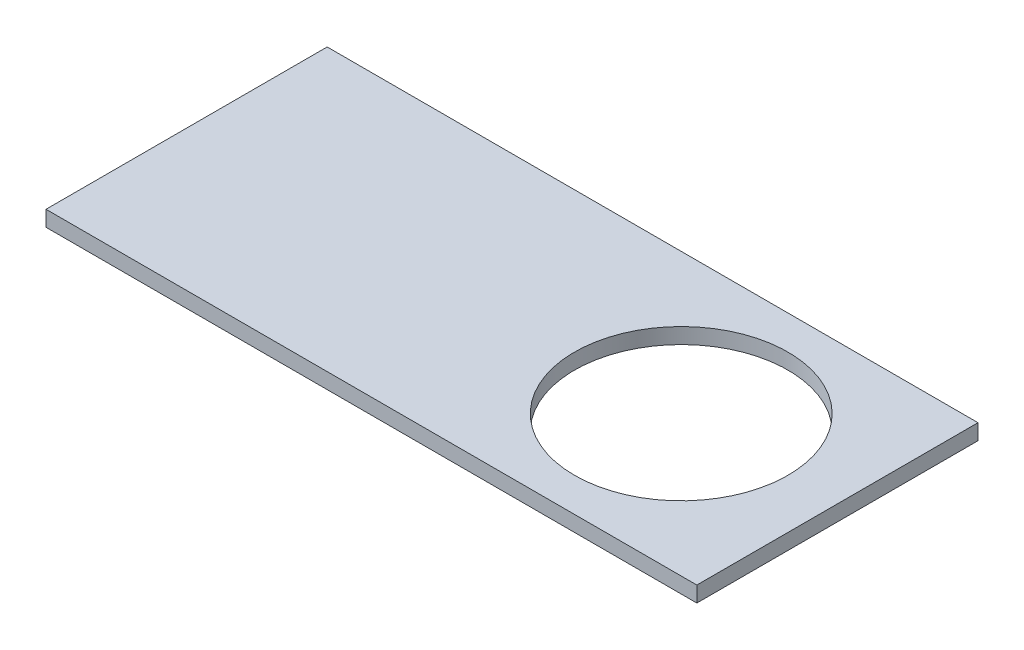
ISO-10303-21;
HEADER;
FILE_DESCRIPTION(('STEP AP214'),'2;1');
FILE_NAME('part.step','',(''),(''),'','','');
FILE_SCHEMA(('AUTOMOTIVE_DESIGN { 1 0 10303 214 1 1 1 1 }'));
ENDSEC;
DATA;
#1=APPLICATION_CONTEXT('core data for automotive mechanical design processes');
#2=APPLICATION_PROTOCOL_DEFINITION('international standard','automotive_design',2000,#1);
#3=PRODUCT_CONTEXT('',#1,'mechanical');
#4=PRODUCT('Part','Part','',(#3));
#5=PRODUCT_RELATED_PRODUCT_CATEGORY('part','',(#4));
#6=PRODUCT_DEFINITION_FORMATION('','',#4);
#7=PRODUCT_DEFINITION_CONTEXT('part definition',#1,'design');
#8=PRODUCT_DEFINITION('design','',#6,#7);
#9=PRODUCT_DEFINITION_SHAPE('','',#8);
#10=(LENGTH_UNIT() NAMED_UNIT(*) SI_UNIT(.MILLI.,.METRE.));
#11=(NAMED_UNIT(*) PLANE_ANGLE_UNIT() SI_UNIT($,.RADIAN.));
#12=(NAMED_UNIT(*) SI_UNIT($,.STERADIAN.) SOLID_ANGLE_UNIT());
#13=UNCERTAINTY_MEASURE_WITH_UNIT(LENGTH_MEASURE(1.E-05),#10,'distance_accuracy_value','');
#14=(GEOMETRIC_REPRESENTATION_CONTEXT(3) GLOBAL_UNCERTAINTY_ASSIGNED_CONTEXT((#13)) GLOBAL_UNIT_ASSIGNED_CONTEXT((#10,
#11,#12)) REPRESENTATION_CONTEXT('',''));
#15=CARTESIAN_POINT('',(0.,0.,0.));
#16=DIRECTION('',(0.,0.,1.));
#17=DIRECTION('',(1.,0.,0.));
#18=AXIS2_PLACEMENT_3D('',#15,#16,#17);
#19=CARTESIAN_POINT('',(0.,6.,0.));
#20=DIRECTION('',(0.,-1.,0.));
#21=DIRECTION('',(0.,0.,-1.));
#22=AXIS2_PLACEMENT_3D('',#19,#20,#21);
#23=PLANE('',#22);
#24=DIRECTION('',(0.,0.,-1.));
#25=VECTOR('',#24,1.);
#26=CARTESIAN_POINT('',(125.,6.,54.));
#27=LINE('',#26,#25);
#28=CARTESIAN_POINT('',(125.,6.,54.));
#29=VERTEX_POINT('',#28);
#30=CARTESIAN_POINT('',(125.,6.,-54.));
#31=VERTEX_POINT('',#30);
#32=EDGE_CURVE('E87',#29,#31,#27,.T.);
#33=ORIENTED_EDGE('',*,*,#32,.T.);
#34=DIRECTION('',(-1.,0.,0.));
#35=VECTOR('',#34,1.);
#36=CARTESIAN_POINT('',(-125.,6.,-53.9999999999999));
#37=LINE('',#36,#35);
#38=CARTESIAN_POINT('',(-125.,6.,-53.9999999999999));
#39=VERTEX_POINT('',#38);
#40=EDGE_CURVE('E82',#31,#39,#37,.T.);
#41=ORIENTED_EDGE('',*,*,#40,.T.);
#42=DIRECTION('',(0.,0.,1.));
#43=VECTOR('',#42,1.);
#44=CARTESIAN_POINT('',(-125.,6.,54.));
#45=LINE('',#44,#43);
#46=CARTESIAN_POINT('',(-125.,6.,54.));
#47=VERTEX_POINT('',#46);
#48=EDGE_CURVE('E85',#39,#47,#45,.T.);
#49=ORIENTED_EDGE('',*,*,#48,.T.);
#50=DIRECTION('',(1.,0.,0.));
#51=VECTOR('',#50,1.);
#52=CARTESIAN_POINT('',(-125.,6.,54.));
#53=LINE('',#52,#51);
#54=EDGE_CURVE('E52',#47,#29,#53,.T.);
#55=ORIENTED_EDGE('',*,*,#54,.T.);
#56=EDGE_LOOP('',(#33,#41,#49,#55));
#57=FACE_BOUND('',#56,.T.);
#58=CARTESIAN_POINT('',(65.,6.,0.));
#59=DIRECTION('',(0.,1.,0.));
#60=DIRECTION('',(0.,0.,1.));
#61=AXIS2_PLACEMENT_3D('',#58,#59,#60);
#62=CIRCLE('',#61,41.);
#63=CARTESIAN_POINT('',(65.,6.,41.));
#64=VERTEX_POINT('',#63);
#65=EDGE_CURVE('E102',#64,#64,#62,.T.);
#66=ORIENTED_EDGE('',*,*,#65,.F.);
#67=EDGE_LOOP('',(#66));
#68=FACE_BOUND('',#67,.T.);
#69=ADVANCED_FACE('F35',(#57,#68),#23,.F.);
#70=CARTESIAN_POINT('',(0.,0.,0.));
#71=DIRECTION('',(0.,-1.,0.));
#72=DIRECTION('',(0.,0.,-1.));
#73=AXIS2_PLACEMENT_3D('',#70,#71,#72);
#74=PLANE('',#73);
#75=DIRECTION('',(0.,0.,-1.));
#76=VECTOR('',#75,1.);
#77=CARTESIAN_POINT('',(125.,0.,54.));
#78=LINE('',#77,#76);
#79=CARTESIAN_POINT('',(125.,0.,54.));
#80=VERTEX_POINT('',#79);
#81=CARTESIAN_POINT('',(125.,0.,-54.));
#82=VERTEX_POINT('',#81);
#83=EDGE_CURVE('E99',#80,#82,#78,.T.);
#84=ORIENTED_EDGE('',*,*,#83,.F.);
#85=DIRECTION('',(1.,0.,0.));
#86=VECTOR('',#85,1.);
#87=CARTESIAN_POINT('',(-125.,0.,54.));
#88=LINE('',#87,#86);
#89=CARTESIAN_POINT('',(-125.,0.,54.));
#90=VERTEX_POINT('',#89);
#91=EDGE_CURVE('E75',#90,#80,#88,.T.);
#92=ORIENTED_EDGE('',*,*,#91,.F.);
#93=DIRECTION('',(0.,0.,1.));
#94=VECTOR('',#93,1.);
#95=CARTESIAN_POINT('',(-125.,0.,54.));
#96=LINE('',#95,#94);
#97=CARTESIAN_POINT('',(-125.,0.,-53.9999999999999));
#98=VERTEX_POINT('',#97);
#99=EDGE_CURVE('E69',#98,#90,#96,.T.);
#100=ORIENTED_EDGE('',*,*,#99,.F.);
#101=DIRECTION('',(-1.,0.,0.));
#102=VECTOR('',#101,1.);
#103=CARTESIAN_POINT('',(-125.,0.,-53.9999999999999));
#104=LINE('',#103,#102);
#105=EDGE_CURVE('E91',#82,#98,#104,.T.);
#106=ORIENTED_EDGE('',*,*,#105,.F.);
#107=EDGE_LOOP('',(#84,#92,#100,#106));
#108=FACE_BOUND('',#107,.T.);
#109=CARTESIAN_POINT('',(65.,0.,0.));
#110=DIRECTION('',(0.,1.,0.));
#111=DIRECTION('',(0.,0.,1.));
#112=AXIS2_PLACEMENT_3D('',#109,#110,#111);
#113=CIRCLE('',#112,41.);
#114=CARTESIAN_POINT('',(65.,0.,41.));
#115=VERTEX_POINT('',#114);
#116=EDGE_CURVE('E114',#115,#115,#113,.T.);
#117=ORIENTED_EDGE('',*,*,#116,.T.);
#118=EDGE_LOOP('',(#117));
#119=FACE_BOUND('',#118,.T.);
#120=ADVANCED_FACE('F110',(#108,#119),#74,.T.);
#121=CARTESIAN_POINT('',(125.,6.,54.));
#122=DIRECTION('',(-1.,0.,0.));
#123=DIRECTION('',(0.,0.,1.));
#124=AXIS2_PLACEMENT_3D('',#121,#122,#123);
#125=PLANE('',#124);
#126=ORIENTED_EDGE('',*,*,#83,.T.);
#127=DIRECTION('',(0.,-1.,0.));
#128=VECTOR('',#127,1.);
#129=CARTESIAN_POINT('',(125.,6.,-54.));
#130=LINE('',#129,#128);
#131=EDGE_CURVE('E11',#31,#82,#130,.T.);
#132=ORIENTED_EDGE('',*,*,#131,.F.);
#133=ORIENTED_EDGE('',*,*,#32,.F.);
#134=DIRECTION('',(0.,-1.,0.));
#135=VECTOR('',#134,1.);
#136=CARTESIAN_POINT('',(125.,6.,54.));
#137=LINE('',#136,#135);
#138=EDGE_CURVE('E95',#29,#80,#137,.T.);
#139=ORIENTED_EDGE('',*,*,#138,.T.);
#140=EDGE_LOOP('',(#126,#132,#133,#139));
#141=FACE_BOUND('',#140,.T.);
#142=ADVANCED_FACE('F37',(#141),#125,.F.);
#143=CARTESIAN_POINT('',(-125.,6.,-53.9999999999999));
#144=DIRECTION('',(0.,0.,1.));
#145=DIRECTION('',(1.,0.,0.));
#146=AXIS2_PLACEMENT_3D('',#143,#144,#145);
#147=PLANE('',#146);
#148=ORIENTED_EDGE('',*,*,#105,.T.);
#149=DIRECTION('',(0.,-1.,0.));
#150=VECTOR('',#149,1.);
#151=CARTESIAN_POINT('',(-125.,6.,-53.9999999999999));
#152=LINE('',#151,#150);
#153=EDGE_CURVE('E44',#39,#98,#152,.T.);
#154=ORIENTED_EDGE('',*,*,#153,.F.);
#155=ORIENTED_EDGE('',*,*,#40,.F.);
#156=ORIENTED_EDGE('',*,*,#131,.T.);
#157=EDGE_LOOP('',(#148,#154,#155,#156));
#158=FACE_BOUND('',#157,.T.);
#159=ADVANCED_FACE('F90',(#158),#147,.F.);
#160=CARTESIAN_POINT('',(-125.,6.,54.));
#161=DIRECTION('',(1.,0.,0.));
#162=DIRECTION('',(0.,0.,-1.));
#163=AXIS2_PLACEMENT_3D('',#160,#161,#162);
#164=PLANE('',#163);
#165=ORIENTED_EDGE('',*,*,#99,.T.);
#166=DIRECTION('',(0.,-1.,0.));
#167=VECTOR('',#166,1.);
#168=CARTESIAN_POINT('',(-125.,6.,54.));
#169=LINE('',#168,#167);
#170=EDGE_CURVE('E92',#47,#90,#169,.T.);
#171=ORIENTED_EDGE('',*,*,#170,.F.);
#172=ORIENTED_EDGE('',*,*,#48,.F.);
#173=ORIENTED_EDGE('',*,*,#153,.T.);
#174=EDGE_LOOP('',(#165,#171,#172,#173));
#175=FACE_BOUND('',#174,.T.);
#176=ADVANCED_FACE('F93',(#175),#164,.F.);
#177=CARTESIAN_POINT('',(-125.,6.,54.));
#178=DIRECTION('',(0.,0.,-1.));
#179=DIRECTION('',(-1.,0.,0.));
#180=AXIS2_PLACEMENT_3D('',#177,#178,#179);
#181=PLANE('',#180);
#182=ORIENTED_EDGE('',*,*,#91,.T.);
#183=ORIENTED_EDGE('',*,*,#138,.F.);
#184=ORIENTED_EDGE('',*,*,#54,.F.);
#185=ORIENTED_EDGE('',*,*,#170,.T.);
#186=EDGE_LOOP('',(#182,#183,#184,#185));
#187=FACE_BOUND('',#186,.T.);
#188=ADVANCED_FACE('F107',(#187),#181,.F.);
#189=CARTESIAN_POINT('',(65.,6.,0.));
#190=DIRECTION('',(0.,-1.,0.));
#191=DIRECTION('',(0.,0.,-1.));
#192=AXIS2_PLACEMENT_3D('',#189,#190,#191);
#193=CYLINDRICAL_SURFACE('',#192,41.);
#194=ORIENTED_EDGE('',*,*,#65,.T.);
#195=EDGE_LOOP('',(#194));
#196=FACE_BOUND('',#195,.T.);
#197=ORIENTED_EDGE('',*,*,#116,.F.);
#198=EDGE_LOOP('',(#197));
#199=FACE_BOUND('',#198,.T.);
#200=ADVANCED_FACE('F120',(#196,#199),#193,.F.);
#201=CLOSED_SHELL('',(#69,#120,#142,#159,#176,#188,#200));
#202=MANIFOLD_SOLID_BREP('B2',#201);
#203=ADVANCED_BREP_SHAPE_REPRESENTATION('',(#18,#202),#14);
#204=SHAPE_DEFINITION_REPRESENTATION(#9,#203);
ENDSEC;
END-ISO-10303-21;
